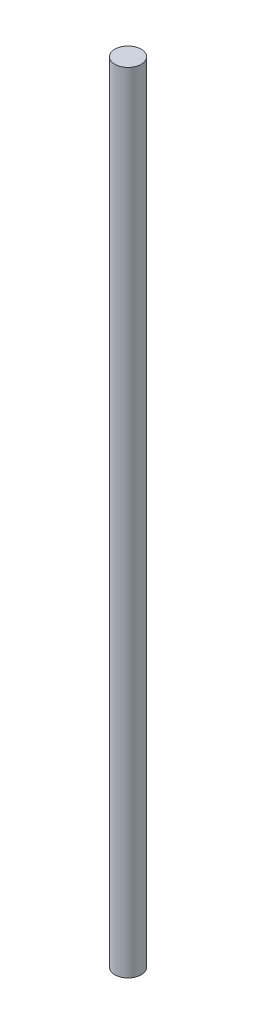
ISO-10303-21;
HEADER;
FILE_DESCRIPTION(('STEP AP214'),'2;1');
FILE_NAME('part.step','',(''),(''),'','','');
FILE_SCHEMA(('AUTOMOTIVE_DESIGN { 1 0 10303 214 1 1 1 1 }'));
ENDSEC;
DATA;
#1=APPLICATION_CONTEXT('core data for automotive mechanical design processes');
#2=APPLICATION_PROTOCOL_DEFINITION('international standard','automotive_design',2000,#1);
#3=PRODUCT_CONTEXT('',#1,'mechanical');
#4=PRODUCT('Part','Part','',(#3));
#5=PRODUCT_RELATED_PRODUCT_CATEGORY('part','',(#4));
#6=PRODUCT_DEFINITION_FORMATION('','',#4);
#7=PRODUCT_DEFINITION_CONTEXT('part definition',#1,'design');
#8=PRODUCT_DEFINITION('design','',#6,#7);
#9=PRODUCT_DEFINITION_SHAPE('','',#8);
#10=(LENGTH_UNIT() NAMED_UNIT(*) SI_UNIT(.MILLI.,.METRE.));
#11=(NAMED_UNIT(*) PLANE_ANGLE_UNIT() SI_UNIT($,.RADIAN.));
#12=(NAMED_UNIT(*) SI_UNIT($,.STERADIAN.) SOLID_ANGLE_UNIT());
#13=UNCERTAINTY_MEASURE_WITH_UNIT(LENGTH_MEASURE(1.E-05),#10,'distance_accuracy_value','');
#14=(GEOMETRIC_REPRESENTATION_CONTEXT(3) GLOBAL_UNCERTAINTY_ASSIGNED_CONTEXT((#13)) GLOBAL_UNIT_ASSIGNED_CONTEXT((#10,
#11,#12)) REPRESENTATION_CONTEXT('',''));
#15=CARTESIAN_POINT('',(0.,0.,0.));
#16=DIRECTION('',(0.,0.,1.));
#17=DIRECTION('',(1.,0.,0.));
#18=AXIS2_PLACEMENT_3D('',#15,#16,#17);
#19=CARTESIAN_POINT('',(0.,90.,0.));
#20=DIRECTION('',(0.,-1.,0.));
#21=DIRECTION('',(0.,0.,-1.));
#22=AXIS2_PLACEMENT_3D('',#19,#20,#21);
#23=CYLINDRICAL_SURFACE('',#22,1.5);
#24=CARTESIAN_POINT('',(0.,90.,0.));
#25=DIRECTION('',(0.,1.,0.));
#26=DIRECTION('',(0.,0.,1.));
#27=AXIS2_PLACEMENT_3D('',#24,#25,#26);
#28=CIRCLE('',#27,1.5);
#29=CARTESIAN_POINT('',(0.,90.,-1.5));
#30=VERTEX_POINT('',#29);
#31=EDGE_CURVE('E10',#30,#30,#28,.T.);
#32=CARTESIAN_POINT('',(0.,0.,0.));
#33=DIRECTION('',(0.,1.,0.));
#34=DIRECTION('',(0.,0.,1.));
#35=AXIS2_PLACEMENT_3D('',#32,#33,#34);
#36=CIRCLE('',#35,1.5);
#37=CARTESIAN_POINT('',(0.,0.,-1.5));
#38=VERTEX_POINT('',#37);
#39=EDGE_CURVE('E36',#38,#38,#36,.T.);
#40=CARTESIAN_POINT('',(0.,90.,-1.5));
#41=CARTESIAN_POINT('',(0.,89.0625,-1.5));
#42=CARTESIAN_POINT('',(0.,88.125,-1.5));
#43=CARTESIAN_POINT('',(0.,86.25,-1.5));
#44=CARTESIAN_POINT('',(0.,85.3125,-1.5));
#45=CARTESIAN_POINT('',(0.,83.4375,-1.5));
#46=CARTESIAN_POINT('',(0.,82.5,-1.5));
#47=CARTESIAN_POINT('',(0.,80.625,-1.5));
#48=CARTESIAN_POINT('',(0.,79.6875,-1.5));
#49=CARTESIAN_POINT('',(0.,77.8125,-1.5));
#50=CARTESIAN_POINT('',(0.,76.875,-1.5));
#51=CARTESIAN_POINT('',(0.,75.,-1.5));
#52=CARTESIAN_POINT('',(0.,74.0625,-1.5));
#53=CARTESIAN_POINT('',(0.,72.1875,-1.5));
#54=CARTESIAN_POINT('',(0.,71.25,-1.5));
#55=CARTESIAN_POINT('',(0.,69.375,-1.5));
#56=CARTESIAN_POINT('',(0.,68.4375,-1.5));
#57=CARTESIAN_POINT('',(0.,66.5625,-1.5));
#58=CARTESIAN_POINT('',(0.,65.625,-1.5));
#59=CARTESIAN_POINT('',(0.,63.75,-1.5));
#60=CARTESIAN_POINT('',(0.,62.8125,-1.5));
#61=CARTESIAN_POINT('',(0.,60.9375,-1.5));
#62=CARTESIAN_POINT('',(0.,60.,-1.5));
#63=CARTESIAN_POINT('',(0.,58.125,-1.5));
#64=CARTESIAN_POINT('',(0.,57.1875,-1.5));
#65=CARTESIAN_POINT('',(0.,55.3125,-1.5));
#66=CARTESIAN_POINT('',(0.,54.375,-1.5));
#67=CARTESIAN_POINT('',(0.,52.5,-1.5));
#68=CARTESIAN_POINT('',(0.,51.5625,-1.5));
#69=CARTESIAN_POINT('',(0.,49.6875,-1.5));
#70=CARTESIAN_POINT('',(0.,48.75,-1.5));
#71=CARTESIAN_POINT('',(0.,46.875,-1.5));
#72=CARTESIAN_POINT('',(0.,45.9375,-1.5));
#73=CARTESIAN_POINT('',(0.,44.0625,-1.5));
#74=CARTESIAN_POINT('',(0.,43.125,-1.5));
#75=CARTESIAN_POINT('',(0.,41.25,-1.5));
#76=CARTESIAN_POINT('',(0.,40.3125,-1.5));
#77=CARTESIAN_POINT('',(0.,38.4375,-1.5));
#78=CARTESIAN_POINT('',(0.,37.5,-1.5));
#79=CARTESIAN_POINT('',(0.,35.625,-1.5));
#80=CARTESIAN_POINT('',(0.,34.6875,-1.5));
#81=CARTESIAN_POINT('',(0.,32.8125,-1.5));
#82=CARTESIAN_POINT('',(0.,31.875,-1.5));
#83=CARTESIAN_POINT('',(0.,30.,-1.5));
#84=CARTESIAN_POINT('',(0.,29.0625,-1.5));
#85=CARTESIAN_POINT('',(0.,27.1875,-1.5));
#86=CARTESIAN_POINT('',(0.,26.25,-1.5));
#87=CARTESIAN_POINT('',(0.,24.375,-1.5));
#88=CARTESIAN_POINT('',(0.,23.4375,-1.5));
#89=CARTESIAN_POINT('',(0.,21.5625,-1.5));
#90=CARTESIAN_POINT('',(0.,20.625,-1.5));
#91=CARTESIAN_POINT('',(0.,18.75,-1.5));
#92=CARTESIAN_POINT('',(0.,17.8125,-1.5));
#93=CARTESIAN_POINT('',(0.,15.9375,-1.5));
#94=CARTESIAN_POINT('',(0.,15.,-1.5));
#95=CARTESIAN_POINT('',(0.,13.125,-1.5));
#96=CARTESIAN_POINT('',(0.,12.1875,-1.5));
#97=CARTESIAN_POINT('',(0.,10.3125,-1.5));
#98=CARTESIAN_POINT('',(0.,9.37499999999999,-1.5));
#99=CARTESIAN_POINT('',(0.,7.49999999999999,-1.5));
#100=CARTESIAN_POINT('',(0.,6.56249999999999,-1.5));
#101=CARTESIAN_POINT('',(0.,4.68749999999999,-1.5));
#102=CARTESIAN_POINT('',(0.,3.74999999999998,-1.5));
#103=CARTESIAN_POINT('',(0.,1.87499999999998,-1.5));
#104=CARTESIAN_POINT('',(0.,0.937499999999986,-1.5));
#105=CARTESIAN_POINT('',(0.,0.,-1.5));
#106=B_SPLINE_CURVE_WITH_KNOTS('',3,(#40,#41,#42,#43,#44,#45,#46,#47,#48,#49,#50,#51,#52,#53,
#54,#55,#56,#57,#58,#59,#60,#61,#62,#63,#64,#65,#66,#67,#68,#69,#70,#71,#72,#73,#74,#75,#76,#77,
#78,#79,#80,#81,#82,#83,#84,#85,#86,#87,#88,#89,#90,#91,#92,#93,#94,#95,#96,#97,#98,#99,#100,
#101,#102,#103,#104,#105),.UNSPECIFIED.,.F.,.F.,(4,2,2,2,2,2,2,2,2,2,2,2,2,2,2,2,2,2,2,2,2,2,2,
2,2,2,2,2,2,2,2,2,4),(0.,2.81250000000001,5.62500000000001,8.43750000000001,11.25,14.0625,
16.875,19.6875,22.5,25.3125,28.125,30.9375,33.75,36.5625,39.375,42.1875,45.,47.8125,50.625,
53.4375,56.25,59.0625,61.875,64.6875,67.5,70.3125,73.125,75.9375,78.75,81.5625,84.375,87.1875,
90.),.UNSPECIFIED.);
#107=EDGE_CURVE('BSEAM33',#30,#38,#106,.T.);
#108=ORIENTED_EDGE('',*,*,#31,.F.);
#109=ORIENTED_EDGE('',*,*,#39,.T.);
#110=ORIENTED_EDGE('',*,*,#107,.T.);
#111=ORIENTED_EDGE('',*,*,#107,.F.);
#112=EDGE_LOOP('',(#108,#110,#109,#111));
#113=FACE_BOUND('',#112,.T.);
#114=ADVANCED_FACE('F33',(#113),#23,.T.);
#115=CARTESIAN_POINT('',(0.,90.,0.));
#116=DIRECTION('',(0.,1.,0.));
#117=DIRECTION('',(0.,0.,1.));
#118=AXIS2_PLACEMENT_3D('',#115,#116,#117);
#119=PLANE('',#118);
#120=ORIENTED_EDGE('',*,*,#31,.T.);
#121=EDGE_LOOP('',(#120));
#122=FACE_BOUND('',#121,.T.);
#123=ADVANCED_FACE('F48',(#122),#119,.T.);
#124=CARTESIAN_POINT('',(0.,0.,0.));
#125=DIRECTION('',(0.,1.,0.));
#126=DIRECTION('',(0.,0.,1.));
#127=AXIS2_PLACEMENT_3D('',#124,#125,#126);
#128=PLANE('',#127);
#129=ORIENTED_EDGE('',*,*,#39,.F.);
#130=EDGE_LOOP('',(#129));
#131=FACE_BOUND('',#130,.T.);
#132=ADVANCED_FACE('F46',(#131),#128,.F.);
#133=CLOSED_SHELL('',(#114,#123,#132));
#134=MANIFOLD_SOLID_BREP('B2',#133);
#135=ADVANCED_BREP_SHAPE_REPRESENTATION('',(#18,#134),#14);
#136=SHAPE_DEFINITION_REPRESENTATION(#9,#135);
ENDSEC;
END-ISO-10303-21;
